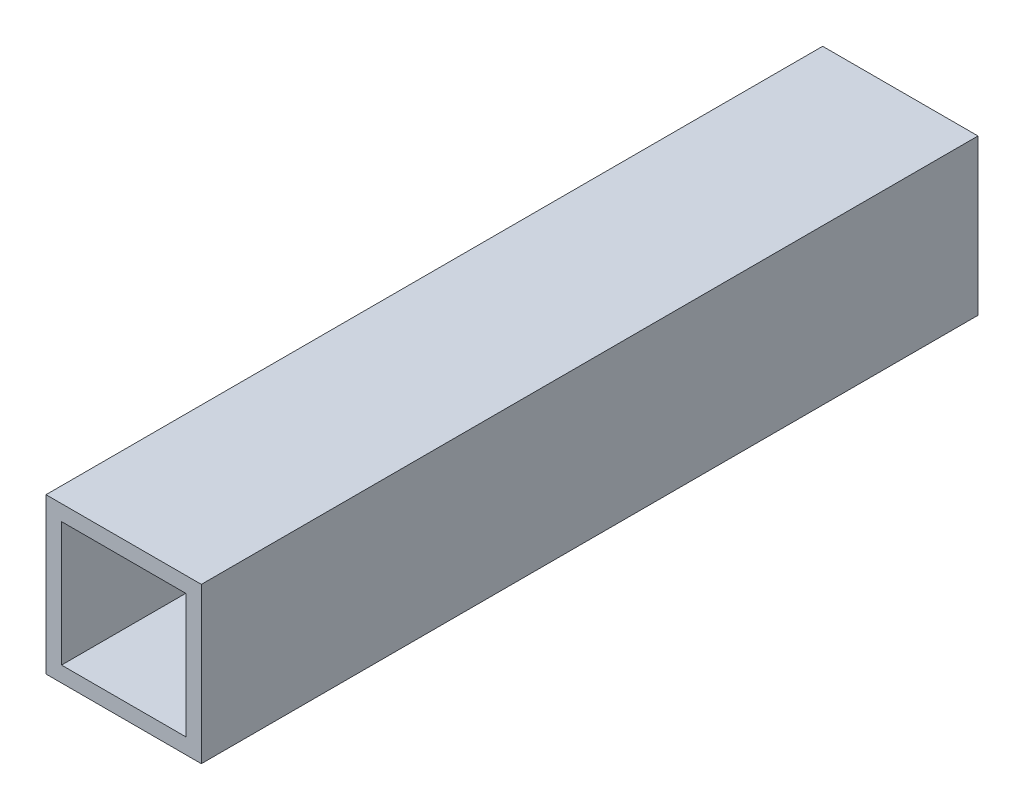
ISO-10303-21;
HEADER;
FILE_DESCRIPTION(('STEP AP214'),'2;1');
FILE_NAME('part.step','',(''),(''),'','','');
FILE_SCHEMA(('AUTOMOTIVE_DESIGN { 1 0 10303 214 1 1 1 1 }'));
ENDSEC;
DATA;
#1=APPLICATION_CONTEXT('core data for automotive mechanical design processes');
#2=APPLICATION_PROTOCOL_DEFINITION('international standard','automotive_design',2000,#1);
#3=PRODUCT_CONTEXT('',#1,'mechanical');
#4=PRODUCT('Part','Part','',(#3));
#5=PRODUCT_RELATED_PRODUCT_CATEGORY('part','',(#4));
#6=PRODUCT_DEFINITION_FORMATION('','',#4);
#7=PRODUCT_DEFINITION_CONTEXT('part definition',#1,'design');
#8=PRODUCT_DEFINITION('design','',#6,#7);
#9=PRODUCT_DEFINITION_SHAPE('','',#8);
#10=(LENGTH_UNIT() NAMED_UNIT(*) SI_UNIT(.MILLI.,.METRE.));
#11=(NAMED_UNIT(*) PLANE_ANGLE_UNIT() SI_UNIT($,.RADIAN.));
#12=(NAMED_UNIT(*) SI_UNIT($,.STERADIAN.) SOLID_ANGLE_UNIT());
#13=UNCERTAINTY_MEASURE_WITH_UNIT(LENGTH_MEASURE(1.E-05),#10,'distance_accuracy_value','');
#14=(GEOMETRIC_REPRESENTATION_CONTEXT(3) GLOBAL_UNCERTAINTY_ASSIGNED_CONTEXT((#13)) GLOBAL_UNIT_ASSIGNED_CONTEXT((#10,
#11,#12)) REPRESENTATION_CONTEXT('',''));
#15=CARTESIAN_POINT('',(0.,0.,0.));
#16=DIRECTION('',(0.,0.,1.));
#17=DIRECTION('',(1.,0.,0.));
#18=AXIS2_PLACEMENT_3D('',#15,#16,#17);
#19=CARTESIAN_POINT('',(-25.,25.,-75.));
#20=DIRECTION('',(-1.,0.,0.));
#21=DIRECTION('',(0.,-1.,0.));
#22=AXIS2_PLACEMENT_3D('',#19,#20,#21);
#23=PLANE('',#22);
#24=DIRECTION('',(0.,0.,1.));
#25=VECTOR('',#24,1.);
#26=CARTESIAN_POINT('',(-25.,-25.,-75.));
#27=LINE('',#26,#25);
#28=CARTESIAN_POINT('',(-25.,-25.,-75.));
#29=VERTEX_POINT('',#28);
#30=CARTESIAN_POINT('',(-25.,-25.,175.));
#31=VERTEX_POINT('',#30);
#32=EDGE_CURVE('E41',#29,#31,#27,.T.);
#33=ORIENTED_EDGE('',*,*,#32,.T.);
#34=DIRECTION('',(0.,-1.,0.));
#35=VECTOR('',#34,1.);
#36=CARTESIAN_POINT('',(-25.,25.,175.));
#37=LINE('',#36,#35);
#38=CARTESIAN_POINT('',(-25.,25.,175.));
#39=VERTEX_POINT('',#38);
#40=EDGE_CURVE('E139',#39,#31,#37,.T.);
#41=ORIENTED_EDGE('',*,*,#40,.F.);
#42=DIRECTION('',(0.,0.,1.));
#43=VECTOR('',#42,1.);
#44=CARTESIAN_POINT('',(-25.,25.,-75.));
#45=LINE('',#44,#43);
#46=CARTESIAN_POINT('',(-25.,25.,-75.));
#47=VERTEX_POINT('',#46);
#48=EDGE_CURVE('E11',#47,#39,#45,.T.);
#49=ORIENTED_EDGE('',*,*,#48,.F.);
#50=DIRECTION('',(0.,-1.,0.));
#51=VECTOR('',#50,1.);
#52=CARTESIAN_POINT('',(-25.,25.,-75.));
#53=LINE('',#52,#51);
#54=EDGE_CURVE('E167',#47,#29,#53,.T.);
#55=ORIENTED_EDGE('',*,*,#54,.T.);
#56=EDGE_LOOP('',(#33,#41,#49,#55));
#57=FACE_BOUND('',#56,.T.);
#58=ADVANCED_FACE('F38',(#57),#23,.T.);
#59=CARTESIAN_POINT('',(-25.,25.,-75.));
#60=DIRECTION('',(0.,1.,0.));
#61=DIRECTION('',(0.,0.,1.));
#62=AXIS2_PLACEMENT_3D('',#59,#60,#61);
#63=PLANE('',#62);
#64=ORIENTED_EDGE('',*,*,#48,.T.);
#65=DIRECTION('',(-1.,0.,0.));
#66=VECTOR('',#65,1.);
#67=CARTESIAN_POINT('',(-25.,25.,175.));
#68=LINE('',#67,#66);
#69=CARTESIAN_POINT('',(25.,25.,175.));
#70=VERTEX_POINT('',#69);
#71=EDGE_CURVE('E151',#70,#39,#68,.T.);
#72=ORIENTED_EDGE('',*,*,#71,.F.);
#73=DIRECTION('',(0.,0.,1.));
#74=VECTOR('',#73,1.);
#75=CARTESIAN_POINT('',(25.,25.,-75.));
#76=LINE('',#75,#74);
#77=CARTESIAN_POINT('',(25.,25.,-75.));
#78=VERTEX_POINT('',#77);
#79=EDGE_CURVE('E47',#78,#70,#76,.T.);
#80=ORIENTED_EDGE('',*,*,#79,.F.);
#81=DIRECTION('',(-1.,0.,0.));
#82=VECTOR('',#81,1.);
#83=CARTESIAN_POINT('',(-25.,25.,-75.));
#84=LINE('',#83,#82);
#85=EDGE_CURVE('E183',#78,#47,#84,.T.);
#86=ORIENTED_EDGE('',*,*,#85,.T.);
#87=EDGE_LOOP('',(#64,#72,#80,#86));
#88=FACE_BOUND('',#87,.T.);
#89=ADVANCED_FACE('F199',(#88),#63,.T.);
#90=CARTESIAN_POINT('',(25.,25.,-75.));
#91=DIRECTION('',(1.,0.,0.));
#92=DIRECTION('',(0.,1.,0.));
#93=AXIS2_PLACEMENT_3D('',#90,#91,#92);
#94=PLANE('',#93);
#95=ORIENTED_EDGE('',*,*,#79,.T.);
#96=DIRECTION('',(0.,1.,0.));
#97=VECTOR('',#96,1.);
#98=CARTESIAN_POINT('',(25.,25.,175.));
#99=LINE('',#98,#97);
#100=CARTESIAN_POINT('',(25.,-25.,175.));
#101=VERTEX_POINT('',#100);
#102=EDGE_CURVE('E147',#101,#70,#99,.T.);
#103=ORIENTED_EDGE('',*,*,#102,.F.);
#104=DIRECTION('',(0.,0.,1.));
#105=VECTOR('',#104,1.);
#106=CARTESIAN_POINT('',(25.,-25.,-75.));
#107=LINE('',#106,#105);
#108=CARTESIAN_POINT('',(25.,-25.,-75.));
#109=VERTEX_POINT('',#108);
#110=EDGE_CURVE('E188',#109,#101,#107,.T.);
#111=ORIENTED_EDGE('',*,*,#110,.F.);
#112=DIRECTION('',(0.,1.,0.));
#113=VECTOR('',#112,1.);
#114=CARTESIAN_POINT('',(25.,25.,-75.));
#115=LINE('',#114,#113);
#116=EDGE_CURVE('E179',#109,#78,#115,.T.);
#117=ORIENTED_EDGE('',*,*,#116,.T.);
#118=EDGE_LOOP('',(#95,#103,#111,#117));
#119=FACE_BOUND('',#118,.T.);
#120=ADVANCED_FACE('F205',(#119),#94,.T.);
#121=CARTESIAN_POINT('',(-25.,-25.,-75.));
#122=DIRECTION('',(0.,-1.,0.));
#123=DIRECTION('',(0.,0.,-1.));
#124=AXIS2_PLACEMENT_3D('',#121,#122,#123);
#125=PLANE('',#124);
#126=ORIENTED_EDGE('',*,*,#110,.T.);
#127=DIRECTION('',(1.,0.,0.));
#128=VECTOR('',#127,1.);
#129=CARTESIAN_POINT('',(-25.,-25.,175.));
#130=LINE('',#129,#128);
#131=EDGE_CURVE('E143',#31,#101,#130,.T.);
#132=ORIENTED_EDGE('',*,*,#131,.F.);
#133=ORIENTED_EDGE('',*,*,#32,.F.);
#134=DIRECTION('',(1.,0.,0.));
#135=VECTOR('',#134,1.);
#136=CARTESIAN_POINT('',(-25.,-25.,-75.));
#137=LINE('',#136,#135);
#138=EDGE_CURVE('E175',#29,#109,#137,.T.);
#139=ORIENTED_EDGE('',*,*,#138,.T.);
#140=EDGE_LOOP('',(#126,#132,#133,#139));
#141=FACE_BOUND('',#140,.T.);
#142=ADVANCED_FACE('F194',(#141),#125,.T.);
#143=CARTESIAN_POINT('',(0.,0.,-75.));
#144=DIRECTION('',(0.,0.,1.));
#145=DIRECTION('',(1.,0.,0.));
#146=AXIS2_PLACEMENT_3D('',#143,#144,#145);
#147=PLANE('',#146);
#148=DIRECTION('',(0.,1.,0.));
#149=VECTOR('',#148,1.);
#150=CARTESIAN_POINT('',(20.,20.,-75.));
#151=LINE('',#150,#149);
#152=CARTESIAN_POINT('',(20.,-20.,-75.));
#153=VERTEX_POINT('',#152);
#154=CARTESIAN_POINT('',(20.,20.,-75.));
#155=VERTEX_POINT('',#154);
#156=EDGE_CURVE('E117',#153,#155,#151,.T.);
#157=ORIENTED_EDGE('',*,*,#156,.T.);
#158=DIRECTION('',(-1.,0.,0.));
#159=VECTOR('',#158,1.);
#160=CARTESIAN_POINT('',(-20.,20.,-75.));
#161=LINE('',#160,#159);
#162=CARTESIAN_POINT('',(-20.,20.,-75.));
#163=VERTEX_POINT('',#162);
#164=EDGE_CURVE('E155',#155,#163,#161,.T.);
#165=ORIENTED_EDGE('',*,*,#164,.T.);
#166=DIRECTION('',(0.,-1.,0.));
#167=VECTOR('',#166,1.);
#168=CARTESIAN_POINT('',(-20.,20.,-75.));
#169=LINE('',#168,#167);
#170=CARTESIAN_POINT('',(-20.,-20.,-75.));
#171=VERTEX_POINT('',#170);
#172=EDGE_CURVE('E111',#163,#171,#169,.T.);
#173=ORIENTED_EDGE('',*,*,#172,.T.);
#174=DIRECTION('',(1.,0.,0.));
#175=VECTOR('',#174,1.);
#176=CARTESIAN_POINT('',(-20.,-20.,-75.));
#177=LINE('',#176,#175);
#178=EDGE_CURVE('E55',#171,#153,#177,.T.);
#179=ORIENTED_EDGE('',*,*,#178,.T.);
#180=EDGE_LOOP('',(#157,#165,#173,#179));
#181=FACE_BOUND('',#180,.T.);
#182=ORIENTED_EDGE('',*,*,#54,.F.);
#183=ORIENTED_EDGE('',*,*,#85,.F.);
#184=ORIENTED_EDGE('',*,*,#116,.F.);
#185=ORIENTED_EDGE('',*,*,#138,.F.);
#186=EDGE_LOOP('',(#182,#183,#184,#185));
#187=FACE_BOUND('',#186,.T.);
#188=ADVANCED_FACE('F203',(#181,#187),#147,.F.);
#189=CARTESIAN_POINT('',(-20.,20.,-75.));
#190=DIRECTION('',(0.,1.,0.));
#191=DIRECTION('',(0.,0.,1.));
#192=AXIS2_PLACEMENT_3D('',#189,#190,#191);
#193=PLANE('',#192);
#194=DIRECTION('',(0.,0.,1.));
#195=VECTOR('',#194,1.);
#196=CARTESIAN_POINT('',(20.,20.,-75.));
#197=LINE('',#196,#195);
#198=CARTESIAN_POINT('',(20.,20.,175.));
#199=VERTEX_POINT('',#198);
#200=EDGE_CURVE('E122',#155,#199,#197,.T.);
#201=ORIENTED_EDGE('',*,*,#200,.T.);
#202=DIRECTION('',(-1.,0.,0.));
#203=VECTOR('',#202,1.);
#204=CARTESIAN_POINT('',(-20.,20.,175.));
#205=LINE('',#204,#203);
#206=CARTESIAN_POINT('',(-20.,20.,175.));
#207=VERTEX_POINT('',#206);
#208=EDGE_CURVE('E120',#199,#207,#205,.T.);
#209=ORIENTED_EDGE('',*,*,#208,.T.);
#210=DIRECTION('',(0.,0.,1.));
#211=VECTOR('',#210,1.);
#212=CARTESIAN_POINT('',(-20.,20.,-75.));
#213=LINE('',#212,#211);
#214=EDGE_CURVE('E104',#163,#207,#213,.T.);
#215=ORIENTED_EDGE('',*,*,#214,.F.);
#216=ORIENTED_EDGE('',*,*,#164,.F.);
#217=EDGE_LOOP('',(#201,#209,#215,#216));
#218=FACE_BOUND('',#217,.T.);
#219=ADVANCED_FACE('F121',(#218),#193,.F.);
#220=CARTESIAN_POINT('',(20.,20.,-75.));
#221=DIRECTION('',(1.,0.,0.));
#222=DIRECTION('',(0.,1.,0.));
#223=AXIS2_PLACEMENT_3D('',#220,#221,#222);
#224=PLANE('',#223);
#225=DIRECTION('',(0.,0.,1.));
#226=VECTOR('',#225,1.);
#227=CARTESIAN_POINT('',(20.,-20.,-75.));
#228=LINE('',#227,#226);
#229=CARTESIAN_POINT('',(20.,-20.,175.));
#230=VERTEX_POINT('',#229);
#231=EDGE_CURVE('E168',#153,#230,#228,.T.);
#232=ORIENTED_EDGE('',*,*,#231,.T.);
#233=DIRECTION('',(0.,1.,0.));
#234=VECTOR('',#233,1.);
#235=CARTESIAN_POINT('',(20.,20.,175.));
#236=LINE('',#235,#234);
#237=EDGE_CURVE('E134',#230,#199,#236,.T.);
#238=ORIENTED_EDGE('',*,*,#237,.T.);
#239=ORIENTED_EDGE('',*,*,#200,.F.);
#240=ORIENTED_EDGE('',*,*,#156,.F.);
#241=EDGE_LOOP('',(#232,#238,#239,#240));
#242=FACE_BOUND('',#241,.T.);
#243=ADVANCED_FACE('F248',(#242),#224,.F.);
#244=CARTESIAN_POINT('',(-20.,-20.,-75.));
#245=DIRECTION('',(0.,-1.,0.));
#246=DIRECTION('',(0.,0.,-1.));
#247=AXIS2_PLACEMENT_3D('',#244,#245,#246);
#248=PLANE('',#247);
#249=DIRECTION('',(0.,0.,1.));
#250=VECTOR('',#249,1.);
#251=CARTESIAN_POINT('',(-20.,-20.,-75.));
#252=LINE('',#251,#250);
#253=CARTESIAN_POINT('',(-20.,-20.,175.));
#254=VERTEX_POINT('',#253);
#255=EDGE_CURVE('E116',#171,#254,#252,.T.);
#256=ORIENTED_EDGE('',*,*,#255,.T.);
#257=DIRECTION('',(1.,0.,0.));
#258=VECTOR('',#257,1.);
#259=CARTESIAN_POINT('',(-20.,-20.,175.));
#260=LINE('',#259,#258);
#261=EDGE_CURVE('E130',#254,#230,#260,.T.);
#262=ORIENTED_EDGE('',*,*,#261,.T.);
#263=ORIENTED_EDGE('',*,*,#231,.F.);
#264=ORIENTED_EDGE('',*,*,#178,.F.);
#265=EDGE_LOOP('',(#256,#262,#263,#264));
#266=FACE_BOUND('',#265,.T.);
#267=ADVANCED_FACE('F257',(#266),#248,.F.);
#268=CARTESIAN_POINT('',(-20.,20.,-75.));
#269=DIRECTION('',(-1.,0.,0.));
#270=DIRECTION('',(0.,-1.,0.));
#271=AXIS2_PLACEMENT_3D('',#268,#269,#270);
#272=PLANE('',#271);
#273=ORIENTED_EDGE('',*,*,#214,.T.);
#274=DIRECTION('',(0.,-1.,0.));
#275=VECTOR('',#274,1.);
#276=CARTESIAN_POINT('',(-20.,20.,175.));
#277=LINE('',#276,#275);
#278=EDGE_CURVE('E108',#207,#254,#277,.T.);
#279=ORIENTED_EDGE('',*,*,#278,.T.);
#280=ORIENTED_EDGE('',*,*,#255,.F.);
#281=ORIENTED_EDGE('',*,*,#172,.F.);
#282=EDGE_LOOP('',(#273,#279,#280,#281));
#283=FACE_BOUND('',#282,.T.);
#284=ADVANCED_FACE('F106',(#283),#272,.F.);
#285=CARTESIAN_POINT('',(0.,0.,175.));
#286=DIRECTION('',(0.,0.,1.));
#287=DIRECTION('',(1.,0.,0.));
#288=AXIS2_PLACEMENT_3D('',#285,#286,#287);
#289=PLANE('',#288);
#290=ORIENTED_EDGE('',*,*,#40,.T.);
#291=ORIENTED_EDGE('',*,*,#131,.T.);
#292=ORIENTED_EDGE('',*,*,#102,.T.);
#293=ORIENTED_EDGE('',*,*,#71,.T.);
#294=EDGE_LOOP('',(#290,#291,#292,#293));
#295=FACE_BOUND('',#294,.T.);
#296=ORIENTED_EDGE('',*,*,#278,.F.);
#297=ORIENTED_EDGE('',*,*,#208,.F.);
#298=ORIENTED_EDGE('',*,*,#237,.F.);
#299=ORIENTED_EDGE('',*,*,#261,.F.);
#300=EDGE_LOOP('',(#296,#297,#298,#299));
#301=FACE_BOUND('',#300,.T.);
#302=ADVANCED_FACE('F128',(#295,#301),#289,.T.);
#303=CLOSED_SHELL('',(#58,#89,#120,#142,#188,#219,#243,#267,#284,#302));
#304=MANIFOLD_SOLID_BREP('B2',#303);
#305=ADVANCED_BREP_SHAPE_REPRESENTATION('',(#18,#304),#14);
#306=SHAPE_DEFINITION_REPRESENTATION(#9,#305);
ENDSEC;
END-ISO-10303-21;
